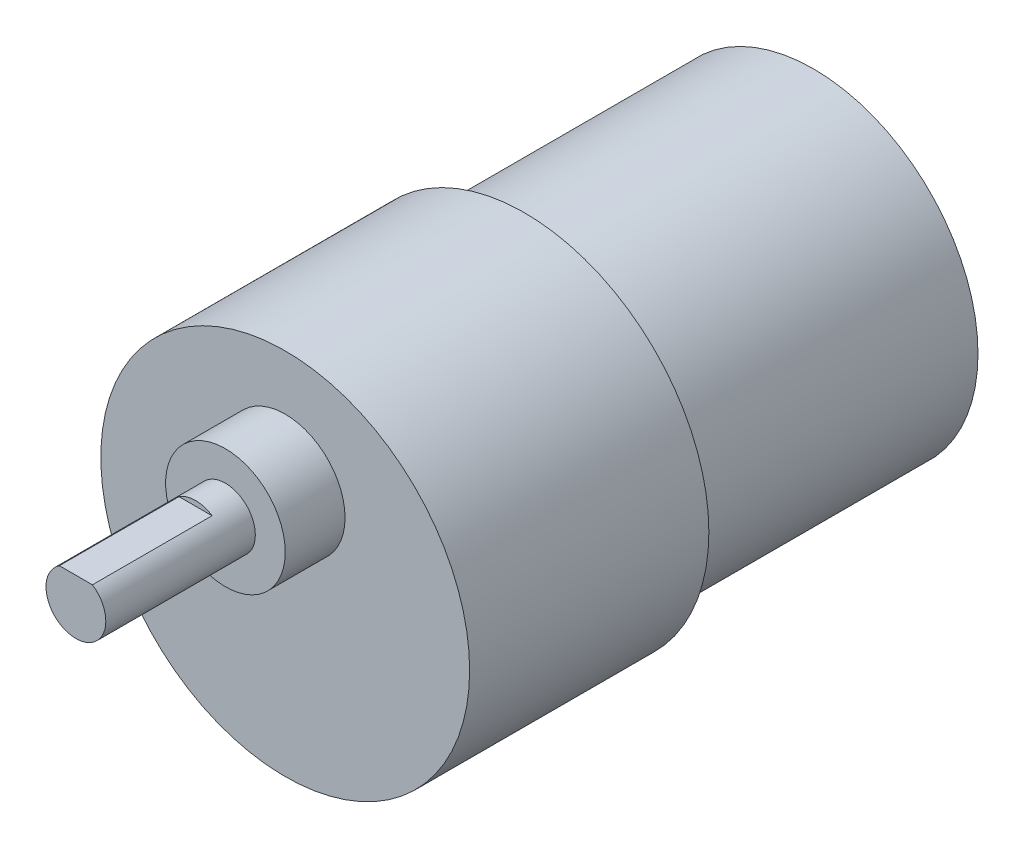
ISO-10303-21;
HEADER;
FILE_DESCRIPTION(('STEP AP214'),'2;1');
FILE_NAME('part.step','',(''),(''),'','','');
FILE_SCHEMA(('AUTOMOTIVE_DESIGN { 1 0 10303 214 1 1 1 1 }'));
ENDSEC;
DATA;
#1=APPLICATION_CONTEXT('core data for automotive mechanical design processes');
#2=APPLICATION_PROTOCOL_DEFINITION('international standard','automotive_design',2000,#1);
#3=PRODUCT_CONTEXT('',#1,'mechanical');
#4=PRODUCT('Part','Part','',(#3));
#5=PRODUCT_RELATED_PRODUCT_CATEGORY('part','',(#4));
#6=PRODUCT_DEFINITION_FORMATION('','',#4);
#7=PRODUCT_DEFINITION_CONTEXT('part definition',#1,'design');
#8=PRODUCT_DEFINITION('design','',#6,#7);
#9=PRODUCT_DEFINITION_SHAPE('','',#8);
#10=(LENGTH_UNIT() NAMED_UNIT(*) SI_UNIT(.MILLI.,.METRE.));
#11=(NAMED_UNIT(*) PLANE_ANGLE_UNIT() SI_UNIT($,.RADIAN.));
#12=(NAMED_UNIT(*) SI_UNIT($,.STERADIAN.) SOLID_ANGLE_UNIT());
#13=UNCERTAINTY_MEASURE_WITH_UNIT(LENGTH_MEASURE(1.E-05),#10,'distance_accuracy_value','');
#14=(GEOMETRIC_REPRESENTATION_CONTEXT(3) GLOBAL_UNCERTAINTY_ASSIGNED_CONTEXT((#13)) GLOBAL_UNIT_ASSIGNED_CONTEXT((#10,
#11,#12)) REPRESENTATION_CONTEXT('',''));
#15=CARTESIAN_POINT('',(0.,0.,0.));
#16=DIRECTION('',(0.,0.,1.));
#17=DIRECTION('',(1.,0.,0.));
#18=AXIS2_PLACEMENT_3D('',#15,#16,#17);
#19=CARTESIAN_POINT('',(0.,7.,74.));
#20=DIRECTION('',(0.,0.,-1.));
#21=DIRECTION('',(-1.,0.,0.));
#22=AXIS2_PLACEMENT_3D('',#19,#20,#21);
#23=CYLINDRICAL_SURFACE('',#22,3.);
#24=CARTESIAN_POINT('',(0.,7.,74.));
#25=DIRECTION('',(0.,0.,1.));
#26=DIRECTION('',(1.,0.,0.));
#27=AXIS2_PLACEMENT_3D('',#24,#25,#26);
#28=CIRCLE('',#27,3.);
#29=CARTESIAN_POINT('',(-1.6583123951777,9.5,74.));
#30=VERTEX_POINT('',#29);
#31=CARTESIAN_POINT('',(1.6583123951777,9.5,74.));
#32=VERTEX_POINT('',#31);
#33=EDGE_CURVE('E76',#30,#32,#28,.T.);
#34=ORIENTED_EDGE('',*,*,#33,.F.);
#35=DIRECTION('',(0.,0.,-1.));
#36=VECTOR('',#35,1.);
#37=CARTESIAN_POINT('',(-1.6583123951777,9.5,74.));
#38=LINE('',#37,#36);
#39=CARTESIAN_POINT('',(-1.6583123951777,9.5,62.));
#40=VERTEX_POINT('',#39);
#41=EDGE_CURVE('E62',#30,#40,#38,.T.);
#42=ORIENTED_EDGE('',*,*,#41,.T.);
#43=CARTESIAN_POINT('',(0.,7.,62.));
#44=DIRECTION('',(0.,0.,1.));
#45=DIRECTION('',(1.,0.,0.));
#46=AXIS2_PLACEMENT_3D('',#43,#44,#45);
#47=CIRCLE('',#46,3.);
#48=CARTESIAN_POINT('',(1.6583123951777,9.5,62.));
#49=VERTEX_POINT('',#48);
#50=EDGE_CURVE('E12',#49,#40,#47,.T.);
#51=ORIENTED_EDGE('',*,*,#50,.F.);
#52=DIRECTION('',(0.,0.,-1.));
#53=VECTOR('',#52,1.);
#54=CARTESIAN_POINT('',(1.6583123951777,9.5,74.));
#55=LINE('',#54,#53);
#56=EDGE_CURVE('E67',#49,#32,#55,.F.);
#57=ORIENTED_EDGE('',*,*,#56,.T.);
#58=EDGE_LOOP('',(#34,#42,#51,#57));
#59=FACE_BOUND('',#58,.T.);
#60=CARTESIAN_POINT('',(0.,7.,59.));
#61=DIRECTION('',(0.,0.,1.));
#62=DIRECTION('',(1.,0.,0.));
#63=AXIS2_PLACEMENT_3D('',#60,#61,#62);
#64=CIRCLE('',#63,3.);
#65=CARTESIAN_POINT('',(3.,7.,59.));
#66=VERTEX_POINT('',#65);
#67=EDGE_CURVE('E83',#66,#66,#64,.T.);
#68=ORIENTED_EDGE('',*,*,#67,.T.);
#69=EDGE_LOOP('',(#68));
#70=FACE_BOUND('',#69,.T.);
#71=ADVANCED_FACE('F48',(#59,#70),#23,.T.);
#72=CARTESIAN_POINT('',(0.,7.,74.));
#73=DIRECTION('',(0.,0.,1.));
#74=DIRECTION('',(1.,0.,0.));
#75=AXIS2_PLACEMENT_3D('',#72,#73,#74);
#76=PLANE('',#75);
#77=DIRECTION('',(1.,0.,0.));
#78=VECTOR('',#77,1.);
#79=CARTESIAN_POINT('',(0.,9.5,74.));
#80=LINE('',#79,#78);
#81=EDGE_CURVE('E55',#30,#32,#80,.T.);
#82=ORIENTED_EDGE('',*,*,#81,.F.);
#83=ORIENTED_EDGE('',*,*,#33,.T.);
#84=EDGE_LOOP('',(#82,#83));
#85=FACE_BOUND('',#84,.T.);
#86=ADVANCED_FACE('F82',(#85),#76,.T.);
#87=CARTESIAN_POINT('',(0.,7.,59.));
#88=DIRECTION('',(0.,0.,1.));
#89=DIRECTION('',(1.,0.,0.));
#90=AXIS2_PLACEMENT_3D('',#87,#88,#89);
#91=PLANE('',#90);
#92=ORIENTED_EDGE('',*,*,#67,.F.);
#93=EDGE_LOOP('',(#92));
#94=FACE_BOUND('',#93,.T.);
#95=ADVANCED_FACE('F92',(#94),#91,.F.);
#96=CARTESIAN_POINT('',(0.,0.,62.));
#97=DIRECTION('',(0.,0.,1.));
#98=DIRECTION('',(1.,0.,0.));
#99=AXIS2_PLACEMENT_3D('',#96,#97,#98);
#100=PLANE('',#99);
#101=ORIENTED_EDGE('',*,*,#50,.T.);
#102=DIRECTION('',(1.,0.,0.));
#103=VECTOR('',#102,1.);
#104=CARTESIAN_POINT('',(-2.80896735508208,9.5,62.));
#105=LINE('',#104,#103);
#106=EDGE_CURVE('E80',#40,#49,#105,.T.);
#107=ORIENTED_EDGE('',*,*,#106,.T.);
#108=EDGE_LOOP('',(#101,#107));
#109=FACE_BOUND('',#108,.T.);
#110=ADVANCED_FACE('F90',(#109),#100,.T.);
#111=CARTESIAN_POINT('',(-2.80896735508208,9.5,62.));
#112=DIRECTION('',(0.,-1.,0.));
#113=DIRECTION('',(0.,0.,-1.));
#114=AXIS2_PLACEMENT_3D('',#111,#112,#113);
#115=PLANE('',#114);
#116=ORIENTED_EDGE('',*,*,#81,.T.);
#117=ORIENTED_EDGE('',*,*,#56,.F.);
#118=ORIENTED_EDGE('',*,*,#106,.F.);
#119=ORIENTED_EDGE('',*,*,#41,.F.);
#120=EDGE_LOOP('',(#116,#117,#118,#119));
#121=FACE_BOUND('',#120,.T.);
#122=ADVANCED_FACE('F72',(#121),#115,.F.);
#123=CLOSED_SHELL('',(#71,#86,#95,#110,#122));
#124=MANIFOLD_SOLID_BREP('B2',#123);
#125=CARTESIAN_POINT('',(0.,7.,59.));
#126=DIRECTION('',(0.,0.,-1.));
#127=DIRECTION('',(-1.,0.,0.));
#128=AXIS2_PLACEMENT_3D('',#125,#126,#127);
#129=CYLINDRICAL_SURFACE('',#128,6.);
#130=CARTESIAN_POINT('',(0.,7.,59.));
#131=DIRECTION('',(0.,0.,1.));
#132=DIRECTION('',(1.,0.,0.));
#133=AXIS2_PLACEMENT_3D('',#130,#131,#132);
#134=CIRCLE('',#133,6.);
#135=CARTESIAN_POINT('',(6.,7.,59.));
#136=VERTEX_POINT('',#135);
#137=EDGE_CURVE('E47',#136,#136,#134,.T.);
#138=ORIENTED_EDGE('',*,*,#137,.F.);
#139=EDGE_LOOP('',(#138));
#140=FACE_BOUND('',#139,.T.);
#141=CARTESIAN_POINT('',(0.,7.,53.));
#142=DIRECTION('',(0.,0.,1.));
#143=DIRECTION('',(1.,0.,0.));
#144=AXIS2_PLACEMENT_3D('',#141,#142,#143);
#145=CIRCLE('',#144,6.);
#146=CARTESIAN_POINT('',(6.,7.,53.));
#147=VERTEX_POINT('',#146);
#148=EDGE_CURVE('E146',#147,#147,#145,.T.);
#149=ORIENTED_EDGE('',*,*,#148,.T.);
#150=EDGE_LOOP('',(#149));
#151=FACE_BOUND('',#150,.T.);
#152=ADVANCED_FACE('F143',(#140,#151),#129,.T.);
#153=CARTESIAN_POINT('',(0.,7.,59.));
#154=DIRECTION('',(0.,0.,1.));
#155=DIRECTION('',(1.,0.,0.));
#156=AXIS2_PLACEMENT_3D('',#153,#154,#155);
#157=PLANE('',#156);
#158=ORIENTED_EDGE('',*,*,#137,.T.);
#159=EDGE_LOOP('',(#158));
#160=FACE_BOUND('',#159,.T.);
#161=ADVANCED_FACE('F158',(#160),#157,.T.);
#162=CARTESIAN_POINT('',(0.,7.,53.));
#163=DIRECTION('',(0.,0.,1.));
#164=DIRECTION('',(1.,0.,0.));
#165=AXIS2_PLACEMENT_3D('',#162,#163,#164);
#166=PLANE('',#165);
#167=ORIENTED_EDGE('',*,*,#148,.F.);
#168=EDGE_LOOP('',(#167));
#169=FACE_BOUND('',#168,.T.);
#170=ADVANCED_FACE('F156',(#169),#166,.F.);
#171=CLOSED_SHELL('',(#152,#161,#170));
#172=MANIFOLD_SOLID_BREP('B6',#171);
#173=CARTESIAN_POINT('',(0.,0.,53.));
#174=DIRECTION('',(0.,0.,-1.));
#175=DIRECTION('',(-1.,0.,0.));
#176=AXIS2_PLACEMENT_3D('',#173,#174,#175);
#177=CYLINDRICAL_SURFACE('',#176,18.5);
#178=CARTESIAN_POINT('',(0.,0.,53.));
#179=DIRECTION('',(0.,0.,1.));
#180=DIRECTION('',(1.,0.,0.));
#181=AXIS2_PLACEMENT_3D('',#178,#179,#180);
#182=CIRCLE('',#181,18.5);
#183=CARTESIAN_POINT('',(18.5,0.,53.));
#184=VERTEX_POINT('',#183);
#185=EDGE_CURVE('E142',#184,#184,#182,.T.);
#186=ORIENTED_EDGE('',*,*,#185,.F.);
#187=EDGE_LOOP('',(#186));
#188=FACE_BOUND('',#187,.T.);
#189=CARTESIAN_POINT('',(0.,0.,29.));
#190=DIRECTION('',(0.,0.,1.));
#191=DIRECTION('',(1.,0.,0.));
#192=AXIS2_PLACEMENT_3D('',#189,#190,#191);
#193=CIRCLE('',#192,18.5);
#194=CARTESIAN_POINT('',(18.5,0.,29.));
#195=VERTEX_POINT('',#194);
#196=EDGE_CURVE('E194',#195,#195,#193,.T.);
#197=ORIENTED_EDGE('',*,*,#196,.T.);
#198=EDGE_LOOP('',(#197));
#199=FACE_BOUND('',#198,.T.);
#200=ADVANCED_FACE('F191',(#188,#199),#177,.T.);
#201=CARTESIAN_POINT('',(0.,0.,53.));
#202=DIRECTION('',(0.,0.,1.));
#203=DIRECTION('',(1.,0.,0.));
#204=AXIS2_PLACEMENT_3D('',#201,#202,#203);
#205=PLANE('',#204);
#206=ORIENTED_EDGE('',*,*,#185,.T.);
#207=EDGE_LOOP('',(#206));
#208=FACE_BOUND('',#207,.T.);
#209=ADVANCED_FACE('F206',(#208),#205,.T.);
#210=CARTESIAN_POINT('',(0.,0.,29.));
#211=DIRECTION('',(0.,0.,1.));
#212=DIRECTION('',(1.,0.,0.));
#213=AXIS2_PLACEMENT_3D('',#210,#211,#212);
#214=PLANE('',#213);
#215=ORIENTED_EDGE('',*,*,#196,.F.);
#216=EDGE_LOOP('',(#215));
#217=FACE_BOUND('',#216,.T.);
#218=ADVANCED_FACE('F204',(#217),#214,.F.);
#219=CLOSED_SHELL('',(#200,#209,#218));
#220=MANIFOLD_SOLID_BREP('B42',#219);
#221=CARTESIAN_POINT('',(0.,0.,29.));
#222=DIRECTION('',(0.,0.,-1.));
#223=DIRECTION('',(-1.,0.,0.));
#224=AXIS2_PLACEMENT_3D('',#221,#222,#223);
#225=CYLINDRICAL_SURFACE('',#224,16.5);
#226=CARTESIAN_POINT('',(0.,0.,29.));
#227=DIRECTION('',(0.,0.,1.));
#228=DIRECTION('',(1.,0.,0.));
#229=AXIS2_PLACEMENT_3D('',#226,#227,#228);
#230=CIRCLE('',#229,16.5);
#231=CARTESIAN_POINT('',(-16.5,0.,29.));
#232=VERTEX_POINT('',#231);
#233=EDGE_CURVE('E190',#232,#232,#230,.T.);
#234=CARTESIAN_POINT('',(0.,0.,0.));
#235=DIRECTION('',(0.,0.,1.));
#236=DIRECTION('',(1.,0.,0.));
#237=AXIS2_PLACEMENT_3D('',#234,#235,#236);
#238=CIRCLE('',#237,16.5);
#239=CARTESIAN_POINT('',(-16.5,0.,0.));
#240=VERTEX_POINT('',#239);
#241=EDGE_CURVE('E235',#240,#240,#238,.T.);
#242=CARTESIAN_POINT('',(-16.5,0.,29.));
#243=CARTESIAN_POINT('',(-16.5,0.,28.6979166666667));
#244=CARTESIAN_POINT('',(-16.5,0.,28.3958333333333));
#245=CARTESIAN_POINT('',(-16.5,0.,27.7916666666667));
#246=CARTESIAN_POINT('',(-16.5,0.,27.4895833333333));
#247=CARTESIAN_POINT('',(-16.5,0.,26.8854166666667));
#248=CARTESIAN_POINT('',(-16.5,0.,26.5833333333333));
#249=CARTESIAN_POINT('',(-16.5,0.,25.9791666666667));
#250=CARTESIAN_POINT('',(-16.5,0.,25.6770833333333));
#251=CARTESIAN_POINT('',(-16.5,0.,25.0729166666667));
#252=CARTESIAN_POINT('',(-16.5,0.,24.7708333333333));
#253=CARTESIAN_POINT('',(-16.5,0.,24.1666666666667));
#254=CARTESIAN_POINT('',(-16.5,0.,23.8645833333333));
#255=CARTESIAN_POINT('',(-16.5,0.,23.2604166666667));
#256=CARTESIAN_POINT('',(-16.5,0.,22.9583333333333));
#257=CARTESIAN_POINT('',(-16.5,0.,22.3541666666667));
#258=CARTESIAN_POINT('',(-16.5,0.,22.0520833333333));
#259=CARTESIAN_POINT('',(-16.5,0.,21.4479166666667));
#260=CARTESIAN_POINT('',(-16.5,0.,21.1458333333333));
#261=CARTESIAN_POINT('',(-16.5,0.,20.5416666666667));
#262=CARTESIAN_POINT('',(-16.5,0.,20.2395833333333));
#263=CARTESIAN_POINT('',(-16.5,0.,19.6354166666667));
#264=CARTESIAN_POINT('',(-16.5,0.,19.3333333333333));
#265=CARTESIAN_POINT('',(-16.5,0.,18.7291666666667));
#266=CARTESIAN_POINT('',(-16.5,0.,18.4270833333333));
#267=CARTESIAN_POINT('',(-16.5,0.,17.8229166666667));
#268=CARTESIAN_POINT('',(-16.5,0.,17.5208333333333));
#269=CARTESIAN_POINT('',(-16.5,0.,16.9166666666667));
#270=CARTESIAN_POINT('',(-16.5,0.,16.6145833333333));
#271=CARTESIAN_POINT('',(-16.5,0.,16.0104166666667));
#272=CARTESIAN_POINT('',(-16.5,0.,15.7083333333333));
#273=CARTESIAN_POINT('',(-16.5,0.,15.1041666666667));
#274=CARTESIAN_POINT('',(-16.5,0.,14.8020833333333));
#275=CARTESIAN_POINT('',(-16.5,0.,14.1979166666667));
#276=CARTESIAN_POINT('',(-16.5,0.,13.8958333333333));
#277=CARTESIAN_POINT('',(-16.5,0.,13.2916666666667));
#278=CARTESIAN_POINT('',(-16.5,0.,12.9895833333333));
#279=CARTESIAN_POINT('',(-16.5,0.,12.3854166666667));
#280=CARTESIAN_POINT('',(-16.5,0.,12.0833333333333));
#281=CARTESIAN_POINT('',(-16.5,0.,11.4791666666667));
#282=CARTESIAN_POINT('',(-16.5,0.,11.1770833333333));
#283=CARTESIAN_POINT('',(-16.5,0.,10.5729166666667));
#284=CARTESIAN_POINT('',(-16.5,0.,10.2708333333333));
#285=CARTESIAN_POINT('',(-16.5,0.,9.66666666666667));
#286=CARTESIAN_POINT('',(-16.5,0.,9.36458333333333));
#287=CARTESIAN_POINT('',(-16.5,0.,8.76041666666667));
#288=CARTESIAN_POINT('',(-16.5,0.,8.45833333333333));
#289=CARTESIAN_POINT('',(-16.5,0.,7.85416666666667));
#290=CARTESIAN_POINT('',(-16.5,0.,7.55208333333333));
#291=CARTESIAN_POINT('',(-16.5,0.,6.94791666666667));
#292=CARTESIAN_POINT('',(-16.5,0.,6.64583333333333));
#293=CARTESIAN_POINT('',(-16.5,0.,6.04166666666667));
#294=CARTESIAN_POINT('',(-16.5,0.,5.73958333333333));
#295=CARTESIAN_POINT('',(-16.5,0.,5.13541666666667));
#296=CARTESIAN_POINT('',(-16.5,0.,4.83333333333333));
#297=CARTESIAN_POINT('',(-16.5,0.,4.22916666666667));
#298=CARTESIAN_POINT('',(-16.5,0.,3.92708333333333));
#299=CARTESIAN_POINT('',(-16.5,0.,3.32291666666667));
#300=CARTESIAN_POINT('',(-16.5,0.,3.02083333333333));
#301=CARTESIAN_POINT('',(-16.5,0.,2.41666666666667));
#302=CARTESIAN_POINT('',(-16.5,0.,2.11458333333333));
#303=CARTESIAN_POINT('',(-16.5,0.,1.51041666666667));
#304=CARTESIAN_POINT('',(-16.5,0.,1.20833333333333));
#305=CARTESIAN_POINT('',(-16.5,0.,0.604166666666667));
#306=CARTESIAN_POINT('',(-16.5,0.,0.302083333333333));
#307=CARTESIAN_POINT('',(-16.5,0.,0.));
#308=B_SPLINE_CURVE_WITH_KNOTS('',3,(#242,#243,#244,#245,#246,#247,#248,#249,#250,#251,#252,
#253,#254,#255,#256,#257,#258,#259,#260,#261,#262,#263,#264,#265,#266,#267,#268,#269,#270,#271,
#272,#273,#274,#275,#276,#277,#278,#279,#280,#281,#282,#283,#284,#285,#286,#287,#288,#289,#290,
#291,#292,#293,#294,#295,#296,#297,#298,#299,#300,#301,#302,#303,#304,#305,#306,#307),
.UNSPECIFIED.,.F.,.F.,(4,2,2,2,2,2,2,2,2,2,2,2,2,2,2,2,2,2,2,2,2,2,2,2,2,2,2,2,2,2,2,2,4),(0.,
0.906250000000001,1.8125,2.71875,3.625,4.53125,5.4375,6.34375,7.25,8.15625,9.0625,9.96875,
10.875,11.78125,12.6875,13.59375,14.5,15.40625,16.3125,17.21875,18.125,19.03125,19.9375,
20.84375,21.75,22.65625,23.5625,24.46875,25.375,26.28125,27.1875,28.09375,29.),.UNSPECIFIED.);
#309=EDGE_CURVE('BSEAM232',#232,#240,#308,.T.);
#310=ORIENTED_EDGE('',*,*,#233,.F.);
#311=ORIENTED_EDGE('',*,*,#241,.T.);
#312=ORIENTED_EDGE('',*,*,#309,.T.);
#313=ORIENTED_EDGE('',*,*,#309,.F.);
#314=EDGE_LOOP('',(#310,#312,#311,#313));
#315=FACE_BOUND('',#314,.T.);
#316=ADVANCED_FACE('F232',(#315),#225,.T.);
#317=CARTESIAN_POINT('',(0.,0.,29.));
#318=DIRECTION('',(0.,0.,1.));
#319=DIRECTION('',(1.,0.,0.));
#320=AXIS2_PLACEMENT_3D('',#317,#318,#319);
#321=PLANE('',#320);
#322=ORIENTED_EDGE('',*,*,#233,.T.);
#323=EDGE_LOOP('',(#322));
#324=FACE_BOUND('',#323,.T.);
#325=ADVANCED_FACE('F247',(#324),#321,.T.);
#326=CARTESIAN_POINT('',(0.,0.,0.));
#327=DIRECTION('',(0.,0.,1.));
#328=DIRECTION('',(1.,0.,0.));
#329=AXIS2_PLACEMENT_3D('',#326,#327,#328);
#330=PLANE('',#329);
#331=ORIENTED_EDGE('',*,*,#241,.F.);
#332=EDGE_LOOP('',(#331));
#333=FACE_BOUND('',#332,.T.);
#334=ADVANCED_FACE('F245',(#333),#330,.F.);
#335=CLOSED_SHELL('',(#316,#325,#334));
#336=MANIFOLD_SOLID_BREP('B137',#335);
#337=ADVANCED_BREP_SHAPE_REPRESENTATION('',(#18,#124,#172,#220,#336),#14);
#338=SHAPE_DEFINITION_REPRESENTATION(#9,#337);
ENDSEC;
END-ISO-10303-21;
